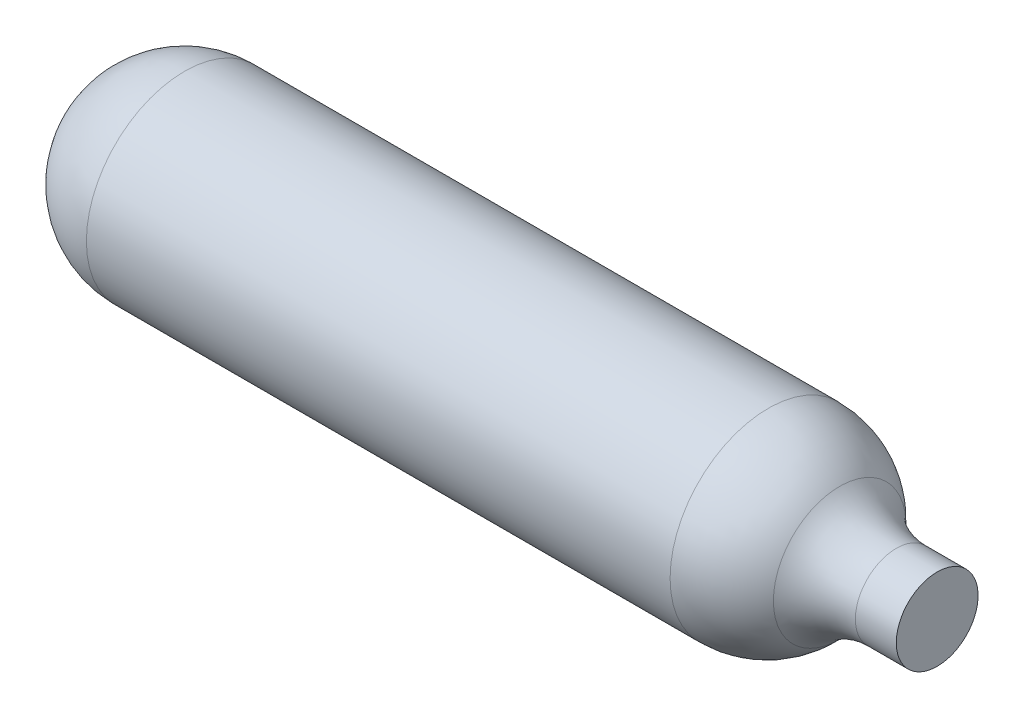
ISO-10303-21;
HEADER;
FILE_DESCRIPTION(('STEP AP214'),'2;1');
FILE_NAME('part.step','',(''),(''),'','','');
FILE_SCHEMA(('AUTOMOTIVE_DESIGN { 1 0 10303 214 1 1 1 1 }'));
ENDSEC;
DATA;
#1=APPLICATION_CONTEXT('core data for automotive mechanical design processes');
#2=APPLICATION_PROTOCOL_DEFINITION('international standard','automotive_design',2000,#1);
#3=PRODUCT_CONTEXT('',#1,'mechanical');
#4=PRODUCT('Part','Part','',(#3));
#5=PRODUCT_RELATED_PRODUCT_CATEGORY('part','',(#4));
#6=PRODUCT_DEFINITION_FORMATION('','',#4);
#7=PRODUCT_DEFINITION_CONTEXT('part definition',#1,'design');
#8=PRODUCT_DEFINITION('design','',#6,#7);
#9=PRODUCT_DEFINITION_SHAPE('','',#8);
#10=(LENGTH_UNIT() NAMED_UNIT(*) SI_UNIT(.MILLI.,.METRE.));
#11=(NAMED_UNIT(*) PLANE_ANGLE_UNIT() SI_UNIT($,.RADIAN.));
#12=(NAMED_UNIT(*) SI_UNIT($,.STERADIAN.) SOLID_ANGLE_UNIT());
#13=UNCERTAINTY_MEASURE_WITH_UNIT(LENGTH_MEASURE(1.E-05),#10,'distance_accuracy_value','');
#14=(GEOMETRIC_REPRESENTATION_CONTEXT(3) GLOBAL_UNCERTAINTY_ASSIGNED_CONTEXT((#13)) GLOBAL_UNIT_ASSIGNED_CONTEXT((#10,
#11,#12)) REPRESENTATION_CONTEXT('',''));
#15=CARTESIAN_POINT('',(0.,0.,0.));
#16=DIRECTION('',(0.,0.,1.));
#17=DIRECTION('',(1.,0.,0.));
#18=AXIS2_PLACEMENT_3D('',#15,#16,#17);
#19=CARTESIAN_POINT('',(78.58125,0.,0.));
#20=DIRECTION('',(-1.,0.,0.));
#21=DIRECTION('',(0.,0.,1.));
#22=AXIS2_PLACEMENT_3D('',#19,#20,#21);
#23=TOROIDAL_SURFACE('',#22,11.3399273486335,7.37117734863354);
#24=CARTESIAN_POINT('',(78.58125,0.,0.));
#25=DIRECTION('',(-1.,0.,0.));
#26=DIRECTION('',(0.,0.,1.));
#27=AXIS2_PLACEMENT_3D('',#24,#25,#26);
#28=CIRCLE('',#27,3.96875);
#29=CARTESIAN_POINT('',(78.58125,0.,3.96875));
#30=VERTEX_POINT('',#29);
#31=EDGE_CURVE('E60',#30,#30,#28,.T.);
#32=ORIENTED_EDGE('',*,*,#31,.T.);
#33=EDGE_LOOP('',(#32));
#34=FACE_BOUND('',#33,.T.);
#35=CARTESIAN_POINT('',(73.0857449257112,0.,0.));
#36=DIRECTION('',(-1.,0.,0.));
#37=DIRECTION('',(0.,0.,1.));
#38=AXIS2_PLACEMENT_3D('',#35,#36,#37);
#39=CIRCLE('',#38,6.42732320383683);
#40=CARTESIAN_POINT('',(73.0857449257112,0.,6.42732320383683));
#41=VERTEX_POINT('',#40);
#42=EDGE_CURVE('E10',#41,#41,#39,.T.);
#43=ORIENTED_EDGE('',*,*,#42,.F.);
#44=EDGE_LOOP('',(#43));
#45=FACE_BOUND('',#44,.T.);
#46=ADVANCED_FACE('F37',(#34,#45),#23,.F.);
#47=CARTESIAN_POINT('',(66.1616889223125,0.,0.));
#48=DIRECTION('',(-1.,0.,0.));
#49=DIRECTION('',(0.,0.,1.));
#50=AXIS2_PLACEMENT_3D('',#47,#48,#49);
#51=DEGENERATE_TOROIDAL_SURFACE('',#50,0.237692630981211,9.28730736901878,.T.);
#52=ORIENTED_EDGE('',*,*,#42,.T.);
#53=EDGE_LOOP('',(#52));
#54=FACE_BOUND('',#53,.T.);
#55=CARTESIAN_POINT('',(66.1616889223125,0.,0.));
#56=DIRECTION('',(-1.,0.,0.));
#57=DIRECTION('',(0.,0.,1.));
#58=AXIS2_PLACEMENT_3D('',#55,#56,#57);
#59=CIRCLE('',#58,9.525);
#60=CARTESIAN_POINT('',(66.1616889223125,0.,9.525));
#61=VERTEX_POINT('',#60);
#62=EDGE_CURVE('E44',#61,#61,#59,.T.);
#63=ORIENTED_EDGE('',*,*,#62,.F.);
#64=EDGE_LOOP('',(#63));
#65=FACE_BOUND('',#64,.T.);
#66=ADVANCED_FACE('F84',(#54,#65),#51,.T.);
#67=CARTESIAN_POINT('',(0.,0.,0.));
#68=DIRECTION('',(-1.,0.,0.));
#69=DIRECTION('',(0.,0.,1.));
#70=AXIS2_PLACEMENT_3D('',#67,#68,#69);
#71=CYLINDRICAL_SURFACE('',#70,9.525);
#72=ORIENTED_EDGE('',*,*,#62,.T.);
#73=EDGE_LOOP('',(#72));
#74=FACE_BOUND('',#73,.T.);
#75=CARTESIAN_POINT('',(9.525,0.,0.));
#76=DIRECTION('',(-1.,0.,0.));
#77=DIRECTION('',(0.,0.,1.));
#78=AXIS2_PLACEMENT_3D('',#75,#76,#77);
#79=CIRCLE('',#78,9.525);
#80=CARTESIAN_POINT('',(9.525,0.,9.525));
#81=VERTEX_POINT('',#80);
#82=EDGE_CURVE('E49',#81,#81,#79,.T.);
#83=ORIENTED_EDGE('',*,*,#82,.F.);
#84=EDGE_LOOP('',(#83));
#85=FACE_BOUND('',#84,.T.);
#86=ADVANCED_FACE('F80',(#74,#85),#71,.T.);
#87=CARTESIAN_POINT('',(9.525,0.,0.));
#88=DIRECTION('',(-1.,0.,0.));
#89=DIRECTION('',(0.,1.,0.));
#90=AXIS2_PLACEMENT_3D('',#87,#88,#89);
#91=SPHERICAL_SURFACE('',#90,9.525);
#92=ORIENTED_EDGE('',*,*,#82,.T.);
#93=EDGE_LOOP('',(#92));
#94=FACE_BOUND('',#93,.T.);
#95=ADVANCED_FACE('F75',(#94),#91,.T.);
#96=CARTESIAN_POINT('',(82.55,0.,0.));
#97=DIRECTION('',(-1.,0.,0.));
#98=DIRECTION('',(0.,0.,1.));
#99=AXIS2_PLACEMENT_3D('',#96,#97,#98);
#100=PLANE('',#99);
#101=CARTESIAN_POINT('',(82.55,0.,0.));
#102=DIRECTION('',(-1.,0.,0.));
#103=DIRECTION('',(0.,0.,1.));
#104=AXIS2_PLACEMENT_3D('',#101,#102,#103);
#105=CIRCLE('',#104,3.96875);
#106=CARTESIAN_POINT('',(82.55,0.,3.96875));
#107=VERTEX_POINT('',#106);
#108=EDGE_CURVE('E54',#107,#107,#105,.T.);
#109=ORIENTED_EDGE('',*,*,#108,.F.);
#110=EDGE_LOOP('',(#109));
#111=FACE_BOUND('',#110,.T.);
#112=ADVANCED_FACE('F70',(#111),#100,.F.);
#113=CARTESIAN_POINT('',(0.,0.,0.));
#114=DIRECTION('',(-1.,0.,0.));
#115=DIRECTION('',(0.,0.,1.));
#116=AXIS2_PLACEMENT_3D('',#113,#114,#115);
#117=CYLINDRICAL_SURFACE('',#116,3.96875);
#118=ORIENTED_EDGE('',*,*,#31,.F.);
#119=EDGE_LOOP('',(#118));
#120=FACE_BOUND('',#119,.T.);
#121=ORIENTED_EDGE('',*,*,#108,.T.);
#122=EDGE_LOOP('',(#121));
#123=FACE_BOUND('',#122,.T.);
#124=ADVANCED_FACE('F67',(#120,#123),#117,.T.);
#125=CLOSED_SHELL('',(#46,#66,#86,#95,#112,#124));
#126=MANIFOLD_SOLID_BREP('B2',#125);
#127=ADVANCED_BREP_SHAPE_REPRESENTATION('',(#18,#126),#14);
#128=SHAPE_DEFINITION_REPRESENTATION(#9,#127);
ENDSEC;
END-ISO-10303-21;
